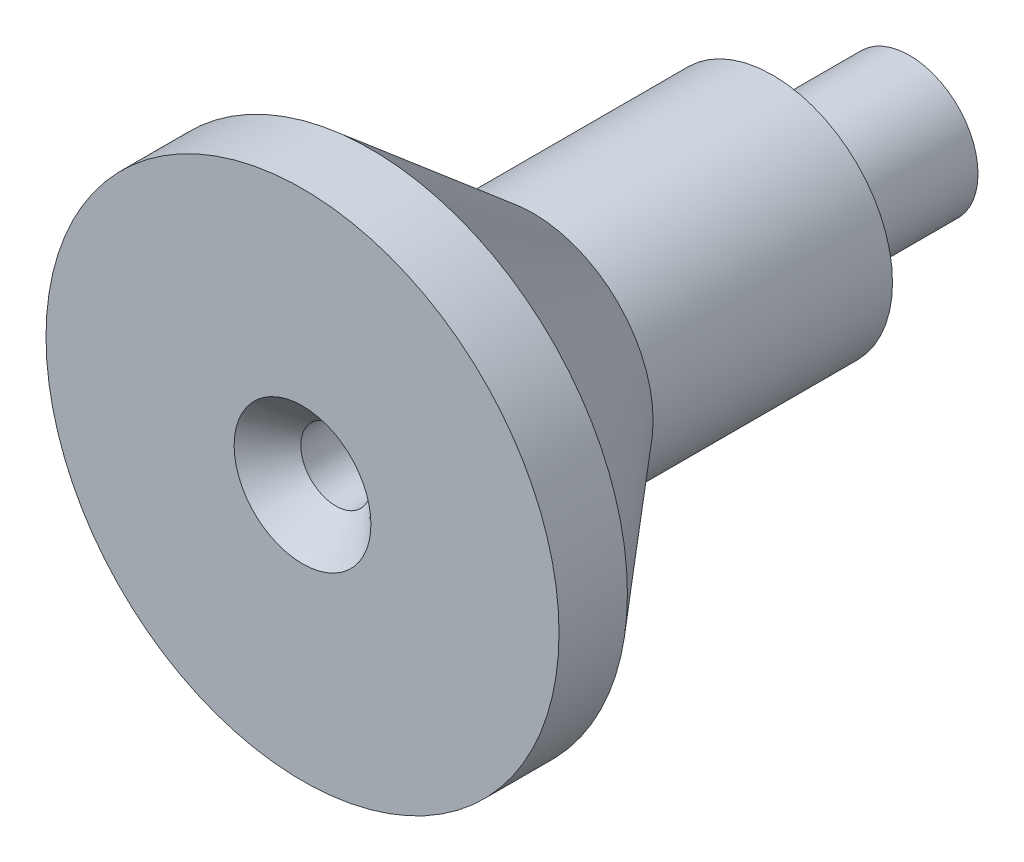
ISO-10303-21;
HEADER;
FILE_DESCRIPTION(('STEP AP214'),'2;1');
FILE_NAME('part.step','',(''),(''),'','','');
FILE_SCHEMA(('AUTOMOTIVE_DESIGN { 1 0 10303 214 1 1 1 1 }'));
ENDSEC;
DATA;
#1=APPLICATION_CONTEXT('core data for automotive mechanical design processes');
#2=APPLICATION_PROTOCOL_DEFINITION('international standard','automotive_design',2000,#1);
#3=PRODUCT_CONTEXT('',#1,'mechanical');
#4=PRODUCT('Part','Part','',(#3));
#5=PRODUCT_RELATED_PRODUCT_CATEGORY('part','',(#4));
#6=PRODUCT_DEFINITION_FORMATION('','',#4);
#7=PRODUCT_DEFINITION_CONTEXT('part definition',#1,'design');
#8=PRODUCT_DEFINITION('design','',#6,#7);
#9=PRODUCT_DEFINITION_SHAPE('','',#8);
#10=(LENGTH_UNIT() NAMED_UNIT(*) SI_UNIT(.MILLI.,.METRE.));
#11=(NAMED_UNIT(*) PLANE_ANGLE_UNIT() SI_UNIT($,.RADIAN.));
#12=(NAMED_UNIT(*) SI_UNIT($,.STERADIAN.) SOLID_ANGLE_UNIT());
#13=UNCERTAINTY_MEASURE_WITH_UNIT(LENGTH_MEASURE(1.E-05),#10,'distance_accuracy_value','');
#14=(GEOMETRIC_REPRESENTATION_CONTEXT(3) GLOBAL_UNCERTAINTY_ASSIGNED_CONTEXT((#13)) GLOBAL_UNIT_ASSIGNED_CONTEXT((#10,
#11,#12)) REPRESENTATION_CONTEXT('',''));
#15=CARTESIAN_POINT('',(0.,0.,0.));
#16=DIRECTION('',(0.,0.,1.));
#17=DIRECTION('',(1.,0.,0.));
#18=AXIS2_PLACEMENT_3D('',#15,#16,#17);
#19=CARTESIAN_POINT('',(0.,0.,0.));
#20=DIRECTION('',(0.,0.,1.));
#21=DIRECTION('',(1.,0.,0.));
#22=AXIS2_PLACEMENT_3D('',#19,#20,#21);
#23=PLANE('',#22);
#24=CARTESIAN_POINT('',(0.,0.,0.));
#25=DIRECTION('',(0.,0.,-1.));
#26=DIRECTION('',(-1.,0.,0.));
#27=AXIS2_PLACEMENT_3D('',#24,#25,#26);
#28=CIRCLE('',#27,2.);
#29=CARTESIAN_POINT('',(-2.,0.,0.));
#30=VERTEX_POINT('',#29);
#31=EDGE_CURVE('E63',#30,#30,#28,.T.);
#32=ORIENTED_EDGE('',*,*,#31,.T.);
#33=EDGE_LOOP('',(#32));
#34=FACE_BOUND('',#33,.T.);
#35=CARTESIAN_POINT('',(0.,0.,0.));
#36=DIRECTION('',(0.,0.,1.));
#37=DIRECTION('',(1.,0.,0.));
#38=AXIS2_PLACEMENT_3D('',#35,#36,#37);
#39=CIRCLE('',#38,7.5);
#40=CARTESIAN_POINT('',(7.5,0.,0.));
#41=VERTEX_POINT('',#40);
#42=EDGE_CURVE('E10',#41,#41,#39,.T.);
#43=ORIENTED_EDGE('',*,*,#42,.T.);
#44=EDGE_LOOP('',(#43));
#45=FACE_BOUND('',#44,.T.);
#46=ADVANCED_FACE('F43',(#34,#45),#23,.T.);
#47=CARTESIAN_POINT('',(0.,0.,0.));
#48=DIRECTION('',(0.,0.,1.));
#49=DIRECTION('',(1.,0.,0.));
#50=AXIS2_PLACEMENT_3D('',#47,#48,#49);
#51=CYLINDRICAL_SURFACE('',#50,7.5);
#52=CARTESIAN_POINT('',(0.,0.,-2.));
#53=DIRECTION('',(0.,0.,1.));
#54=DIRECTION('',(1.,0.,0.));
#55=AXIS2_PLACEMENT_3D('',#52,#53,#54);
#56=CIRCLE('',#55,7.5);
#57=CARTESIAN_POINT('',(7.5,0.,-2.));
#58=VERTEX_POINT('',#57);
#59=EDGE_CURVE('E51',#58,#58,#56,.T.);
#60=ORIENTED_EDGE('',*,*,#59,.T.);
#61=EDGE_LOOP('',(#60));
#62=FACE_BOUND('',#61,.T.);
#63=ORIENTED_EDGE('',*,*,#42,.F.);
#64=EDGE_LOOP('',(#63));
#65=FACE_BOUND('',#64,.T.);
#66=ADVANCED_FACE('F114',(#62,#65),#51,.T.);
#67=CARTESIAN_POINT('',(0.,0.,-2.));
#68=DIRECTION('',(0.,0.,1.));
#69=DIRECTION('',(1.,0.,0.));
#70=AXIS2_PLACEMENT_3D('',#67,#68,#69);
#71=CONICAL_SURFACE('',#70,7.5,0.699892869719244);
#72=CARTESIAN_POINT('',(0.,0.,-6.75));
#73=DIRECTION('',(0.,0.,1.));
#74=DIRECTION('',(1.,0.,0.));
#75=AXIS2_PLACEMENT_3D('',#72,#73,#74);
#76=CIRCLE('',#75,3.5);
#77=CARTESIAN_POINT('',(3.5,0.,-6.75));
#78=VERTEX_POINT('',#77);
#79=EDGE_CURVE('E57',#78,#78,#76,.T.);
#80=ORIENTED_EDGE('',*,*,#79,.T.);
#81=EDGE_LOOP('',(#80));
#82=FACE_BOUND('',#81,.T.);
#83=ORIENTED_EDGE('',*,*,#59,.F.);
#84=EDGE_LOOP('',(#83));
#85=FACE_BOUND('',#84,.T.);
#86=ADVANCED_FACE('F99',(#82,#85),#71,.T.);
#87=CARTESIAN_POINT('',(0.,0.,0.));
#88=DIRECTION('',(0.,0.,1.));
#89=DIRECTION('',(1.,0.,0.));
#90=AXIS2_PLACEMENT_3D('',#87,#88,#89);
#91=CYLINDRICAL_SURFACE('',#90,3.5);
#92=CARTESIAN_POINT('',(0.,0.,-13.75));
#93=DIRECTION('',(0.,0.,1.));
#94=DIRECTION('',(1.,0.,0.));
#95=AXIS2_PLACEMENT_3D('',#92,#93,#94);
#96=CIRCLE('',#95,3.5);
#97=CARTESIAN_POINT('',(3.5,0.,-13.75));
#98=VERTEX_POINT('',#97);
#99=EDGE_CURVE('E92',#98,#98,#96,.T.);
#100=ORIENTED_EDGE('',*,*,#99,.T.);
#101=EDGE_LOOP('',(#100));
#102=FACE_BOUND('',#101,.T.);
#103=ORIENTED_EDGE('',*,*,#79,.F.);
#104=EDGE_LOOP('',(#103));
#105=FACE_BOUND('',#104,.T.);
#106=ADVANCED_FACE('F102',(#102,#105),#91,.T.);
#107=CARTESIAN_POINT('',(3.5,0.,-13.75));
#108=DIRECTION('',(0.,0.,-1.));
#109=DIRECTION('',(-1.,0.,0.));
#110=AXIS2_PLACEMENT_3D('',#107,#108,#109);
#111=PLANE('',#110);
#112=CARTESIAN_POINT('',(0.,0.,-13.75));
#113=DIRECTION('',(0.,0.,1.));
#114=DIRECTION('',(1.,0.,0.));
#115=AXIS2_PLACEMENT_3D('',#112,#113,#114);
#116=CIRCLE('',#115,2.);
#117=CARTESIAN_POINT('',(2.,0.,-13.75));
#118=VERTEX_POINT('',#117);
#119=EDGE_CURVE('E88',#118,#118,#116,.T.);
#120=ORIENTED_EDGE('',*,*,#119,.T.);
#121=EDGE_LOOP('',(#120));
#122=FACE_BOUND('',#121,.T.);
#123=ORIENTED_EDGE('',*,*,#99,.F.);
#124=EDGE_LOOP('',(#123));
#125=FACE_BOUND('',#124,.T.);
#126=ADVANCED_FACE('F104',(#122,#125),#111,.T.);
#127=CARTESIAN_POINT('',(0.,0.,0.));
#128=DIRECTION('',(0.,0.,1.));
#129=DIRECTION('',(1.,0.,0.));
#130=AXIS2_PLACEMENT_3D('',#127,#128,#129);
#131=CYLINDRICAL_SURFACE('',#130,2.);
#132=CARTESIAN_POINT('',(0.,0.,-17.75));
#133=DIRECTION('',(0.,0.,1.));
#134=DIRECTION('',(1.,0.,0.));
#135=AXIS2_PLACEMENT_3D('',#132,#133,#134);
#136=CIRCLE('',#135,2.);
#137=CARTESIAN_POINT('',(2.,0.,-17.75));
#138=VERTEX_POINT('',#137);
#139=EDGE_CURVE('E69',#138,#138,#136,.T.);
#140=ORIENTED_EDGE('',*,*,#139,.T.);
#141=EDGE_LOOP('',(#140));
#142=FACE_BOUND('',#141,.T.);
#143=ORIENTED_EDGE('',*,*,#119,.F.);
#144=EDGE_LOOP('',(#143));
#145=FACE_BOUND('',#144,.T.);
#146=ADVANCED_FACE('F111',(#142,#145),#131,.T.);
#147=CARTESIAN_POINT('',(2.,0.,-17.75));
#148=DIRECTION('',(0.,0.,-1.));
#149=DIRECTION('',(-1.,0.,0.));
#150=AXIS2_PLACEMENT_3D('',#147,#148,#149);
#151=PLANE('',#150);
#152=CARTESIAN_POINT('',(0.,0.,-17.75));
#153=DIRECTION('',(0.,0.,-1.));
#154=DIRECTION('',(-1.,0.,0.));
#155=AXIS2_PLACEMENT_3D('',#152,#153,#154);
#156=CIRCLE('',#155,1.24999999999999);
#157=CARTESIAN_POINT('',(-1.24999999999999,0.,-17.75));
#158=VERTEX_POINT('',#157);
#159=EDGE_CURVE('E77',#158,#158,#156,.T.);
#160=ORIENTED_EDGE('',*,*,#159,.F.);
#161=EDGE_LOOP('',(#160));
#162=FACE_BOUND('',#161,.T.);
#163=ORIENTED_EDGE('',*,*,#139,.F.);
#164=EDGE_LOOP('',(#163));
#165=FACE_BOUND('',#164,.T.);
#166=ADVANCED_FACE('F127',(#162,#165),#151,.T.);
#167=CARTESIAN_POINT('',(0.,0.,0.));
#168=DIRECTION('',(0.,0.,1.));
#169=DIRECTION('',(1.,0.,0.));
#170=AXIS2_PLACEMENT_3D('',#167,#168,#169);
#171=CONICAL_SURFACE('',#170,2.,0.785398163397448);
#172=CARTESIAN_POINT('',(0.,0.,-0.975000000000008));
#173=DIRECTION('',(0.,0.,1.));
#174=DIRECTION('',(1.,0.,0.));
#175=AXIS2_PLACEMENT_3D('',#172,#173,#174);
#176=CIRCLE('',#175,1.02499999999999);
#177=CARTESIAN_POINT('',(1.02499999999999,0.,-0.975000000000008));
#178=VERTEX_POINT('',#177);
#179=EDGE_CURVE('E60',#178,#178,#176,.T.);
#180=ORIENTED_EDGE('',*,*,#179,.F.);
#181=EDGE_LOOP('',(#180));
#182=FACE_BOUND('',#181,.T.);
#183=ORIENTED_EDGE('',*,*,#31,.F.);
#184=EDGE_LOOP('',(#183));
#185=FACE_BOUND('',#184,.T.);
#186=ADVANCED_FACE('F124',(#182,#185),#171,.F.);
#187=CARTESIAN_POINT('',(0.,0.,0.));
#188=DIRECTION('',(0.,0.,1.));
#189=DIRECTION('',(1.,0.,0.));
#190=AXIS2_PLACEMENT_3D('',#187,#188,#189);
#191=CYLINDRICAL_SURFACE('',#190,1.02499999999999);
#192=CARTESIAN_POINT('',(0.,0.,-7.61480636071881));
#193=DIRECTION('',(0.,0.,-1.));
#194=DIRECTION('',(-1.,0.,0.));
#195=AXIS2_PLACEMENT_3D('',#192,#193,#194);
#196=CIRCLE('',#195,1.02499999999999);
#197=CARTESIAN_POINT('',(-1.02499999999999,0.,-7.61480636071881));
#198=VERTEX_POINT('',#197);
#199=EDGE_CURVE('E46',#198,#198,#196,.T.);
#200=ORIENTED_EDGE('',*,*,#199,.T.);
#201=EDGE_LOOP('',(#200));
#202=FACE_BOUND('',#201,.T.);
#203=ORIENTED_EDGE('',*,*,#179,.T.);
#204=EDGE_LOOP('',(#203));
#205=FACE_BOUND('',#204,.T.);
#206=ADVANCED_FACE('F126',(#202,#205),#191,.F.);
#207=CARTESIAN_POINT('',(0.,0.,-7.75000000000001));
#208=DIRECTION('',(0.,0.,-1.));
#209=DIRECTION('',(-1.,0.,0.));
#210=AXIS2_PLACEMENT_3D('',#207,#208,#209);
#211=CONICAL_SURFACE('',#210,1.24999999999999,1.02974425867665);
#212=CARTESIAN_POINT('',(0.,0.,-7.75000000000001));
#213=DIRECTION('',(0.,0.,-1.));
#214=DIRECTION('',(-1.,0.,0.));
#215=AXIS2_PLACEMENT_3D('',#212,#213,#214);
#216=CIRCLE('',#215,1.24999999999999);
#217=CARTESIAN_POINT('',(-1.24999999999999,0.,-7.75000000000001));
#218=VERTEX_POINT('',#217);
#219=EDGE_CURVE('E72',#218,#218,#216,.T.);
#220=ORIENTED_EDGE('',*,*,#219,.T.);
#221=EDGE_LOOP('',(#220));
#222=FACE_BOUND('',#221,.T.);
#223=ORIENTED_EDGE('',*,*,#199,.F.);
#224=EDGE_LOOP('',(#223));
#225=FACE_BOUND('',#224,.T.);
#226=ADVANCED_FACE('F134',(#222,#225),#211,.F.);
#227=CARTESIAN_POINT('',(0.,0.,-17.75));
#228=DIRECTION('',(0.,0.,-1.));
#229=DIRECTION('',(-1.,0.,0.));
#230=AXIS2_PLACEMENT_3D('',#227,#228,#229);
#231=CYLINDRICAL_SURFACE('',#230,1.24999999999999);
#232=ORIENTED_EDGE('',*,*,#219,.F.);
#233=EDGE_LOOP('',(#232));
#234=FACE_BOUND('',#233,.T.);
#235=ORIENTED_EDGE('',*,*,#159,.T.);
#236=EDGE_LOOP('',(#235));
#237=FACE_BOUND('',#236,.T.);
#238=ADVANCED_FACE('F164',(#234,#237),#231,.F.);
#239=CLOSED_SHELL('',(#46,#66,#86,#106,#126,#146,#166,#186,#206,#226,#238));
#240=MANIFOLD_SOLID_BREP('B2',#239);
#241=ADVANCED_BREP_SHAPE_REPRESENTATION('',(#18,#240),#14);
#242=SHAPE_DEFINITION_REPRESENTATION(#9,#241);
ENDSEC;
END-ISO-10303-21;
